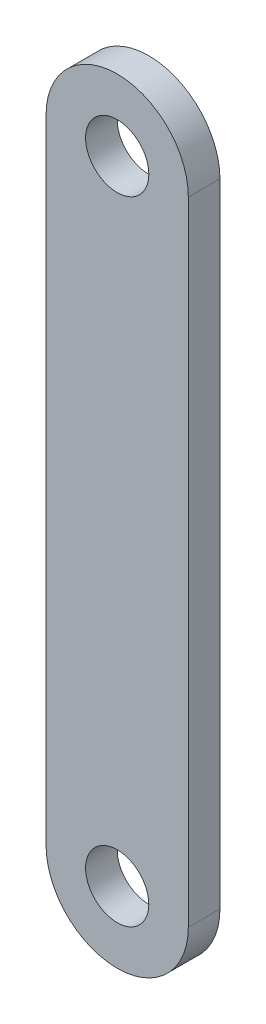
ISO-10303-21;
HEADER;
FILE_DESCRIPTION(('STEP AP214'),'2;1');
FILE_NAME('part.step','',(''),(''),'','','');
FILE_SCHEMA(('AUTOMOTIVE_DESIGN { 1 0 10303 214 1 1 1 1 }'));
ENDSEC;
DATA;
#1=APPLICATION_CONTEXT('core data for automotive mechanical design processes');
#2=APPLICATION_PROTOCOL_DEFINITION('international standard','automotive_design',2000,#1);
#3=PRODUCT_CONTEXT('',#1,'mechanical');
#4=PRODUCT('Part','Part','',(#3));
#5=PRODUCT_RELATED_PRODUCT_CATEGORY('part','',(#4));
#6=PRODUCT_DEFINITION_FORMATION('','',#4);
#7=PRODUCT_DEFINITION_CONTEXT('part definition',#1,'design');
#8=PRODUCT_DEFINITION('design','',#6,#7);
#9=PRODUCT_DEFINITION_SHAPE('','',#8);
#10=(LENGTH_UNIT() NAMED_UNIT(*) SI_UNIT(.MILLI.,.METRE.));
#11=(NAMED_UNIT(*) PLANE_ANGLE_UNIT() SI_UNIT($,.RADIAN.));
#12=(NAMED_UNIT(*) SI_UNIT($,.STERADIAN.) SOLID_ANGLE_UNIT());
#13=UNCERTAINTY_MEASURE_WITH_UNIT(LENGTH_MEASURE(1.E-05),#10,'distance_accuracy_value','');
#14=(GEOMETRIC_REPRESENTATION_CONTEXT(3) GLOBAL_UNCERTAINTY_ASSIGNED_CONTEXT((#13)) GLOBAL_UNIT_ASSIGNED_CONTEXT((#10,
#11,#12)) REPRESENTATION_CONTEXT('',''));
#15=CARTESIAN_POINT('',(0.,0.,0.));
#16=DIRECTION('',(0.,0.,1.));
#17=DIRECTION('',(1.,0.,0.));
#18=AXIS2_PLACEMENT_3D('',#15,#16,#17);
#19=CARTESIAN_POINT('',(0.,0.,10.));
#20=DIRECTION('',(0.,0.,1.));
#21=DIRECTION('',(1.,0.,0.));
#22=AXIS2_PLACEMENT_3D('',#19,#20,#21);
#23=PLANE('',#22);
#24=CARTESIAN_POINT('',(0.,0.,10.));
#25=DIRECTION('',(0.,0.,1.));
#26=DIRECTION('',(1.,0.,0.));
#27=AXIS2_PLACEMENT_3D('',#24,#25,#26);
#28=CIRCLE('',#27,10.);
#29=CARTESIAN_POINT('',(10.,0.,10.));
#30=VERTEX_POINT('',#29);
#31=EDGE_CURVE('E112',#30,#30,#28,.T.);
#32=ORIENTED_EDGE('',*,*,#31,.F.);
#33=EDGE_LOOP('',(#32));
#34=FACE_BOUND('',#33,.T.);
#35=CARTESIAN_POINT('',(0.,0.,10.));
#36=DIRECTION('',(0.,0.,1.));
#37=DIRECTION('',(1.,0.,0.));
#38=AXIS2_PLACEMENT_3D('',#35,#36,#37);
#39=CIRCLE('',#38,22.5);
#40=CARTESIAN_POINT('',(22.5,0.,10.));
#41=VERTEX_POINT('',#40);
#42=CARTESIAN_POINT('',(-22.5,0.,10.));
#43=VERTEX_POINT('',#42);
#44=EDGE_CURVE('E92',#41,#43,#39,.T.);
#45=ORIENTED_EDGE('',*,*,#44,.T.);
#46=DIRECTION('',(0.,-1.,0.));
#47=VECTOR('',#46,1.);
#48=CARTESIAN_POINT('',(-22.5,0.,10.));
#49=LINE('',#48,#47);
#50=CARTESIAN_POINT('',(-22.5,-200.,10.));
#51=VERTEX_POINT('',#50);
#52=EDGE_CURVE('E87',#43,#51,#49,.T.);
#53=ORIENTED_EDGE('',*,*,#52,.T.);
#54=CARTESIAN_POINT('',(0.,-200.,10.));
#55=DIRECTION('',(0.,0.,1.));
#56=DIRECTION('',(1.,0.,0.));
#57=AXIS2_PLACEMENT_3D('',#54,#55,#56);
#58=CIRCLE('',#57,22.5);
#59=CARTESIAN_POINT('',(22.5,-200.,10.));
#60=VERTEX_POINT('',#59);
#61=EDGE_CURVE('E90',#51,#60,#58,.T.);
#62=ORIENTED_EDGE('',*,*,#61,.T.);
#63=DIRECTION('',(0.,1.,0.));
#64=VECTOR('',#63,1.);
#65=CARTESIAN_POINT('',(22.5,0.,10.));
#66=LINE('',#65,#64);
#67=EDGE_CURVE('E57',#60,#41,#66,.T.);
#68=ORIENTED_EDGE('',*,*,#67,.T.);
#69=EDGE_LOOP('',(#45,#53,#62,#68));
#70=FACE_BOUND('',#69,.T.);
#71=CARTESIAN_POINT('',(0.,-200.,10.));
#72=DIRECTION('',(0.,0.,1.));
#73=DIRECTION('',(1.,0.,0.));
#74=AXIS2_PLACEMENT_3D('',#71,#72,#73);
#75=CIRCLE('',#74,10.);
#76=CARTESIAN_POINT('',(10.,-200.,10.));
#77=VERTEX_POINT('',#76);
#78=EDGE_CURVE('E134',#77,#77,#75,.T.);
#79=ORIENTED_EDGE('',*,*,#78,.F.);
#80=EDGE_LOOP('',(#79));
#81=FACE_BOUND('',#80,.T.);
#82=ADVANCED_FACE('F39',(#34,#70,#81),#23,.T.);
#83=CARTESIAN_POINT('',(0.,0.,0.));
#84=DIRECTION('',(0.,0.,1.));
#85=DIRECTION('',(1.,0.,0.));
#86=AXIS2_PLACEMENT_3D('',#83,#84,#85);
#87=PLANE('',#86);
#88=CARTESIAN_POINT('',(0.,0.,0.));
#89=DIRECTION('',(0.,0.,1.));
#90=DIRECTION('',(1.,0.,0.));
#91=AXIS2_PLACEMENT_3D('',#88,#89,#90);
#92=CIRCLE('',#91,10.);
#93=CARTESIAN_POINT('',(10.,0.,0.));
#94=VERTEX_POINT('',#93);
#95=EDGE_CURVE('E130',#94,#94,#92,.T.);
#96=ORIENTED_EDGE('',*,*,#95,.T.);
#97=EDGE_LOOP('',(#96));
#98=FACE_BOUND('',#97,.T.);
#99=CARTESIAN_POINT('',(0.,0.,0.));
#100=DIRECTION('',(0.,0.,1.));
#101=DIRECTION('',(1.,0.,0.));
#102=AXIS2_PLACEMENT_3D('',#99,#100,#101);
#103=CIRCLE('',#102,22.5);
#104=CARTESIAN_POINT('',(22.5,0.,0.));
#105=VERTEX_POINT('',#104);
#106=CARTESIAN_POINT('',(-22.5,0.,0.));
#107=VERTEX_POINT('',#106);
#108=EDGE_CURVE('E108',#105,#107,#103,.T.);
#109=ORIENTED_EDGE('',*,*,#108,.F.);
#110=DIRECTION('',(0.,1.,0.));
#111=VECTOR('',#110,1.);
#112=CARTESIAN_POINT('',(22.5,0.,0.));
#113=LINE('',#112,#111);
#114=CARTESIAN_POINT('',(22.5,-200.,0.));
#115=VERTEX_POINT('',#114);
#116=EDGE_CURVE('E80',#115,#105,#113,.T.);
#117=ORIENTED_EDGE('',*,*,#116,.F.);
#118=CARTESIAN_POINT('',(0.,-200.,0.));
#119=DIRECTION('',(0.,0.,1.));
#120=DIRECTION('',(1.,0.,0.));
#121=AXIS2_PLACEMENT_3D('',#118,#119,#120);
#122=CIRCLE('',#121,22.5);
#123=CARTESIAN_POINT('',(-22.5,-200.,0.));
#124=VERTEX_POINT('',#123);
#125=EDGE_CURVE('E74',#124,#115,#122,.T.);
#126=ORIENTED_EDGE('',*,*,#125,.F.);
#127=DIRECTION('',(0.,-1.,0.));
#128=VECTOR('',#127,1.);
#129=CARTESIAN_POINT('',(-22.5,0.,0.));
#130=LINE('',#129,#128);
#131=EDGE_CURVE('E97',#107,#124,#130,.T.);
#132=ORIENTED_EDGE('',*,*,#131,.F.);
#133=EDGE_LOOP('',(#109,#117,#126,#132));
#134=FACE_BOUND('',#133,.T.);
#135=CARTESIAN_POINT('',(0.,-200.,0.));
#136=DIRECTION('',(0.,0.,1.));
#137=DIRECTION('',(1.,0.,0.));
#138=AXIS2_PLACEMENT_3D('',#135,#136,#137);
#139=CIRCLE('',#138,10.);
#140=CARTESIAN_POINT('',(10.,-200.,0.));
#141=VERTEX_POINT('',#140);
#142=EDGE_CURVE('E138',#141,#141,#139,.T.);
#143=ORIENTED_EDGE('',*,*,#142,.T.);
#144=EDGE_LOOP('',(#143));
#145=FACE_BOUND('',#144,.T.);
#146=ADVANCED_FACE('F125',(#98,#134,#145),#87,.F.);
#147=CARTESIAN_POINT('',(0.,0.,10.));
#148=DIRECTION('',(0.,0.,-1.));
#149=DIRECTION('',(-1.,0.,0.));
#150=AXIS2_PLACEMENT_3D('',#147,#148,#149);
#151=CYLINDRICAL_SURFACE('',#150,22.5);
#152=ORIENTED_EDGE('',*,*,#108,.T.);
#153=DIRECTION('',(0.,0.,-1.));
#154=VECTOR('',#153,1.);
#155=CARTESIAN_POINT('',(-22.5,0.,10.));
#156=LINE('',#155,#154);
#157=EDGE_CURVE('E11',#43,#107,#156,.T.);
#158=ORIENTED_EDGE('',*,*,#157,.F.);
#159=ORIENTED_EDGE('',*,*,#44,.F.);
#160=DIRECTION('',(0.,0.,-1.));
#161=VECTOR('',#160,1.);
#162=CARTESIAN_POINT('',(22.5,0.,10.));
#163=LINE('',#162,#161);
#164=EDGE_CURVE('E104',#41,#105,#163,.T.);
#165=ORIENTED_EDGE('',*,*,#164,.T.);
#166=EDGE_LOOP('',(#152,#158,#159,#165));
#167=FACE_BOUND('',#166,.T.);
#168=ADVANCED_FACE('F41',(#167),#151,.T.);
#169=CARTESIAN_POINT('',(-22.5,0.,10.));
#170=DIRECTION('',(1.,0.,0.));
#171=DIRECTION('',(0.,1.,0.));
#172=AXIS2_PLACEMENT_3D('',#169,#170,#171);
#173=PLANE('',#172);
#174=ORIENTED_EDGE('',*,*,#131,.T.);
#175=DIRECTION('',(0.,0.,-1.));
#176=VECTOR('',#175,1.);
#177=CARTESIAN_POINT('',(-22.5,-200.,10.));
#178=LINE('',#177,#176);
#179=EDGE_CURVE('E49',#51,#124,#178,.T.);
#180=ORIENTED_EDGE('',*,*,#179,.F.);
#181=ORIENTED_EDGE('',*,*,#52,.F.);
#182=ORIENTED_EDGE('',*,*,#157,.T.);
#183=EDGE_LOOP('',(#174,#180,#181,#182));
#184=FACE_BOUND('',#183,.T.);
#185=ADVANCED_FACE('F96',(#184),#173,.F.);
#186=CARTESIAN_POINT('',(0.,-200.,10.));
#187=DIRECTION('',(0.,0.,-1.));
#188=DIRECTION('',(-1.,0.,0.));
#189=AXIS2_PLACEMENT_3D('',#186,#187,#188);
#190=CYLINDRICAL_SURFACE('',#189,22.5);
#191=ORIENTED_EDGE('',*,*,#125,.T.);
#192=DIRECTION('',(0.,0.,-1.));
#193=VECTOR('',#192,1.);
#194=CARTESIAN_POINT('',(22.5,-200.,10.));
#195=LINE('',#194,#193);
#196=EDGE_CURVE('E99',#60,#115,#195,.T.);
#197=ORIENTED_EDGE('',*,*,#196,.F.);
#198=ORIENTED_EDGE('',*,*,#61,.F.);
#199=ORIENTED_EDGE('',*,*,#179,.T.);
#200=EDGE_LOOP('',(#191,#197,#198,#199));
#201=FACE_BOUND('',#200,.T.);
#202=ADVANCED_FACE('F100',(#201),#190,.T.);
#203=CARTESIAN_POINT('',(22.5,0.,10.));
#204=DIRECTION('',(-1.,0.,0.));
#205=DIRECTION('',(0.,-1.,0.));
#206=AXIS2_PLACEMENT_3D('',#203,#204,#205);
#207=PLANE('',#206);
#208=ORIENTED_EDGE('',*,*,#116,.T.);
#209=ORIENTED_EDGE('',*,*,#164,.F.);
#210=ORIENTED_EDGE('',*,*,#67,.F.);
#211=ORIENTED_EDGE('',*,*,#196,.T.);
#212=EDGE_LOOP('',(#208,#209,#210,#211));
#213=FACE_BOUND('',#212,.T.);
#214=ADVANCED_FACE('F122',(#213),#207,.F.);
#215=CARTESIAN_POINT('',(0.,0.,10.));
#216=DIRECTION('',(0.,0.,-1.));
#217=DIRECTION('',(-1.,0.,0.));
#218=AXIS2_PLACEMENT_3D('',#215,#216,#217);
#219=CYLINDRICAL_SURFACE('',#218,10.);
#220=ORIENTED_EDGE('',*,*,#31,.T.);
#221=EDGE_LOOP('',(#220));
#222=FACE_BOUND('',#221,.T.);
#223=ORIENTED_EDGE('',*,*,#95,.F.);
#224=EDGE_LOOP('',(#223));
#225=FACE_BOUND('',#224,.T.);
#226=ADVANCED_FACE('F158',(#222,#225),#219,.F.);
#227=CARTESIAN_POINT('',(0.,-200.,10.));
#228=DIRECTION('',(0.,0.,-1.));
#229=DIRECTION('',(-1.,0.,0.));
#230=AXIS2_PLACEMENT_3D('',#227,#228,#229);
#231=CYLINDRICAL_SURFACE('',#230,10.);
#232=ORIENTED_EDGE('',*,*,#78,.T.);
#233=EDGE_LOOP('',(#232));
#234=FACE_BOUND('',#233,.T.);
#235=ORIENTED_EDGE('',*,*,#142,.F.);
#236=EDGE_LOOP('',(#235));
#237=FACE_BOUND('',#236,.T.);
#238=ADVANCED_FACE('F146',(#234,#237),#231,.F.);
#239=CLOSED_SHELL('',(#82,#146,#168,#185,#202,#214,#226,#238));
#240=MANIFOLD_SOLID_BREP('B2',#239);
#241=ADVANCED_BREP_SHAPE_REPRESENTATION('',(#18,#240),#14);
#242=SHAPE_DEFINITION_REPRESENTATION(#9,#241);
ENDSEC;
END-ISO-10303-21;
